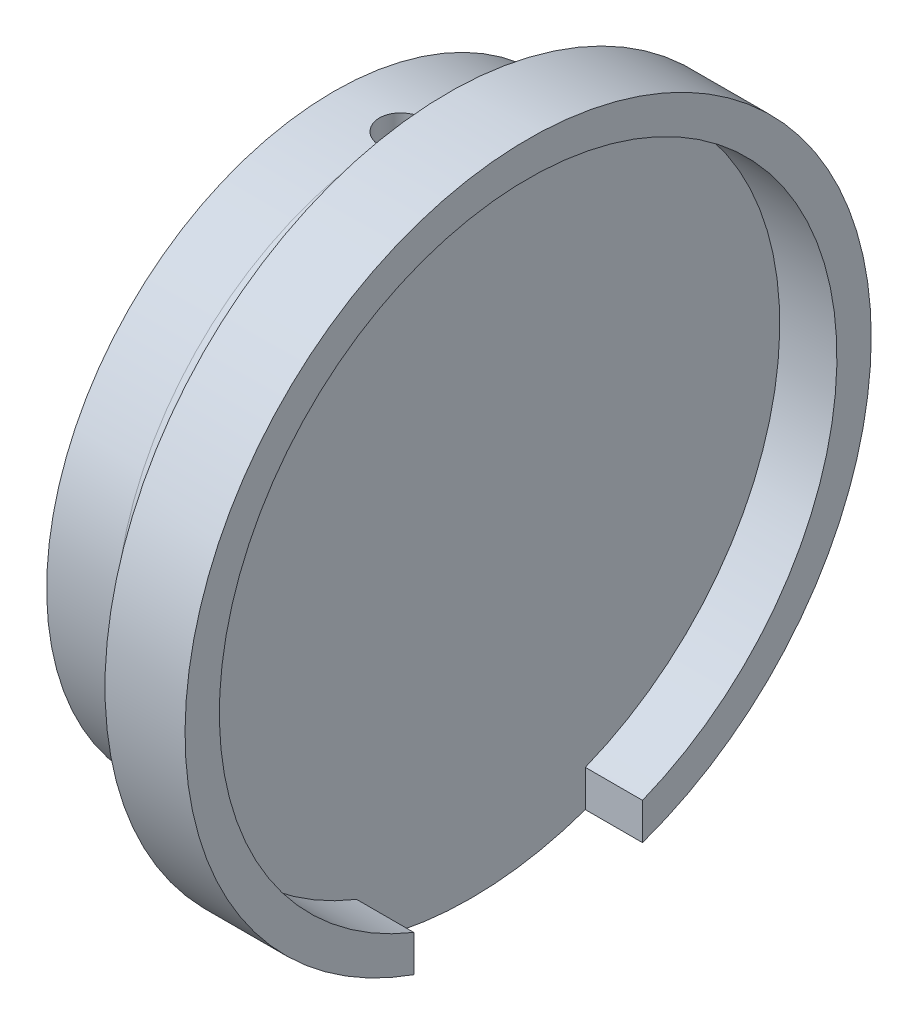
ISO-10303-21;
HEADER;
FILE_DESCRIPTION(('STEP AP214'),'2;1');
FILE_NAME('part.step','',(''),(''),'','','');
FILE_SCHEMA(('AUTOMOTIVE_DESIGN { 1 0 10303 214 1 1 1 1 }'));
ENDSEC;
DATA;
#1=APPLICATION_CONTEXT('core data for automotive mechanical design processes');
#2=APPLICATION_PROTOCOL_DEFINITION('international standard','automotive_design',2000,#1);
#3=PRODUCT_CONTEXT('',#1,'mechanical');
#4=PRODUCT('Part','Part','',(#3));
#5=PRODUCT_RELATED_PRODUCT_CATEGORY('part','',(#4));
#6=PRODUCT_DEFINITION_FORMATION('','',#4);
#7=PRODUCT_DEFINITION_CONTEXT('part definition',#1,'design');
#8=PRODUCT_DEFINITION('design','',#6,#7);
#9=PRODUCT_DEFINITION_SHAPE('','',#8);
#10=(LENGTH_UNIT() NAMED_UNIT(*) SI_UNIT(.MILLI.,.METRE.));
#11=(NAMED_UNIT(*) PLANE_ANGLE_UNIT() SI_UNIT($,.RADIAN.));
#12=(NAMED_UNIT(*) SI_UNIT($,.STERADIAN.) SOLID_ANGLE_UNIT());
#13=UNCERTAINTY_MEASURE_WITH_UNIT(LENGTH_MEASURE(1.E-05),#10,'distance_accuracy_value','');
#14=(GEOMETRIC_REPRESENTATION_CONTEXT(3) GLOBAL_UNCERTAINTY_ASSIGNED_CONTEXT((#13)) GLOBAL_UNIT_ASSIGNED_CONTEXT((#10,
#11,#12)) REPRESENTATION_CONTEXT('',''));
#15=CARTESIAN_POINT('',(0.,0.,0.));
#16=DIRECTION('',(0.,0.,1.));
#17=DIRECTION('',(1.,0.,0.));
#18=AXIS2_PLACEMENT_3D('',#15,#16,#17);
#19=CARTESIAN_POINT('',(6.,0.,0.));
#20=DIRECTION('',(-1.,0.,0.));
#21=DIRECTION('',(0.,0.,1.));
#22=AXIS2_PLACEMENT_3D('',#19,#20,#21);
#23=CYLINDRICAL_SURFACE('',#22,12.55);
#24=CARTESIAN_POINT('',(0.,0.,0.));
#25=DIRECTION('',(1.,0.,0.));
#26=DIRECTION('',(0.,0.,-1.));
#27=AXIS2_PLACEMENT_3D('',#24,#25,#26);
#28=CIRCLE('',#27,12.55);
#29=CARTESIAN_POINT('',(0.,0.,-12.55));
#30=VERTEX_POINT('',#29);
#31=EDGE_CURVE('E203',#30,#30,#28,.T.);
#32=ORIENTED_EDGE('',*,*,#31,.T.);
#33=EDGE_LOOP('',(#32));
#34=FACE_BOUND('',#33,.T.);
#35=CARTESIAN_POINT('',(3.,12.5100959228936,-1.));
#36=CARTESIAN_POINT('',(3.05607469499357,12.5100964526146,-0.999997546739263));
#37=CARTESIAN_POINT('',(3.11218777829105,12.5104770009579,-0.995267578739973));
#38=CARTESIAN_POINT('',(3.22286198828818,12.5119580995085,-0.976468119966159));
#39=CARTESIAN_POINT('',(3.27742127318235,12.5130594698738,-0.962387990224174));
#40=CARTESIAN_POINT('',(3.38336889513245,12.5158566801776,-0.92529745917909));
#41=CARTESIAN_POINT('',(3.43475898700157,12.5175521875971,-0.902292052289981));
#42=CARTESIAN_POINT('',(3.53293576691366,12.5213462134671,-0.848012739207154));
#43=CARTESIAN_POINT('',(3.57972344976571,12.5234446445349,-0.816740625271618));
#44=CARTESIAN_POINT('',(3.66749010381706,12.5278136397397,-0.746735746382406));
#45=CARTESIAN_POINT('',(3.70845673066781,12.5300845544623,-0.707987525551142));
#46=CARTESIAN_POINT('',(3.78331239267315,12.5345394227661,-0.624162947427995));
#47=CARTESIAN_POINT('',(3.81720112139419,12.5367233725788,-0.579086316292429));
#48=CARTESIAN_POINT('',(3.87697962329371,12.5407615169639,-0.483811425514186));
#49=CARTESIAN_POINT('',(3.90285878363937,12.5426152726547,-0.433606486854583));
#50=CARTESIAN_POINT('',(3.9458156437529,12.545780394251,-0.329546749074967));
#51=CARTESIAN_POINT('',(3.96289348582533,12.5470917689259,-0.275692008982885));
#52=CARTESIAN_POINT('',(3.98772758479719,12.5490219255725,-0.165983724330662));
#53=CARTESIAN_POINT('',(3.99550372447972,12.5496421846377,-0.110134706930861));
#54=CARTESIAN_POINT('',(4.00157513516299,12.5501252240788,0.002079034375169));
#55=CARTESIAN_POINT('',(3.99987056888868,12.5499880174557,0.0584437494134894));
#56=CARTESIAN_POINT('',(3.98704524038246,12.5489728062233,0.169954111105817));
#57=CARTESIAN_POINT('',(3.97594585996639,12.5480964837961,0.22510223442625));
#58=CARTESIAN_POINT('',(3.94467920796125,12.5457035602777,0.332750208832182));
#59=CARTESIAN_POINT('',(3.92451185639069,12.544186953539,0.385250036554592));
#60=CARTESIAN_POINT('',(3.87565783364616,12.540681212723,0.486179301478755));
#61=CARTESIAN_POINT('',(3.84696156418825,12.5386915467812,0.534604073484158));
#62=CARTESIAN_POINT('',(3.78187125821065,12.5344633477448,0.625957702846895));
#63=CARTESIAN_POINT('',(3.74547707914956,12.5322248100424,0.668886458411425));
#64=CARTESIAN_POINT('',(3.66590349251671,12.5277431693269,0.748154439305018));
#65=CARTESIAN_POINT('',(3.6227055096142,12.5255000709151,0.784475020541218));
#66=CARTESIAN_POINT('',(3.53081534861313,12.5212683907724,0.849351662321607));
#67=CARTESIAN_POINT('',(3.48212316652859,12.5192798092262,0.877907717232668));
#68=CARTESIAN_POINT('',(3.38061395081758,12.5157819109752,0.926443874440319));
#69=CARTESIAN_POINT('',(3.32779646973718,12.5142726463502,0.946423044907074));
#70=CARTESIAN_POINT('',(3.21954203575353,12.511905236907,0.977224677627526));
#71=CARTESIAN_POINT('',(3.16410513316293,12.5110470795881,0.988047315680286));
#72=CARTESIAN_POINT('',(3.05234854912301,12.5100810358463,1.00020513989674));
#73=CARTESIAN_POINT('',(2.99603171134505,12.5099710946849,1.00156630920588));
#74=CARTESIAN_POINT('',(2.88397063069316,12.510508505902,0.994830585723685));
#75=CARTESIAN_POINT('',(2.82822638294691,12.5111558518311,0.986733773480174));
#76=CARTESIAN_POINT('',(2.71896723047464,12.513133021653,0.961333571720078));
#77=CARTESIAN_POINT('',(2.66544949645185,12.5144619489041,0.944042276737334));
#78=CARTESIAN_POINT('',(2.56207496192578,12.5176517945726,0.900756231934743));
#79=CARTESIAN_POINT('',(2.51221821521745,12.5195127208053,0.874761354254707));
#80=CARTESIAN_POINT('',(2.41746191531079,12.5235618627505,0.814740167453415));
#81=CARTESIAN_POINT('',(2.37257337199629,12.525750781029,0.780696524978534));
#82=CARTESIAN_POINT('',(2.28913890307259,12.5302068745256,0.705569253844884));
#83=CARTESIAN_POINT('',(2.25059307735842,12.5324740509754,0.664485514328466));
#84=CARTESIAN_POINT('',(2.18084970885845,12.5368373019557,0.576332072132416));
#85=CARTESIAN_POINT('',(2.14966903471841,12.5389329766574,0.529249001172144));
#86=CARTESIAN_POINT('',(2.09565675364316,12.5427113392584,0.430500138453741));
#87=CARTESIAN_POINT('',(2.07282506944572,12.5443940309794,0.378834389109589));
#88=CARTESIAN_POINT('',(2.03618791938598,12.5471549822108,0.272447522197831));
#89=CARTESIAN_POINT('',(2.02237197449091,12.5482339432313,0.217730032301262));
#90=CARTESIAN_POINT('',(2.00412422917633,12.5496687028929,0.106743026463964));
#91=CARTESIAN_POINT('',(1.99969226786936,12.5500245139323,0.0504735371488685));
#92=CARTESIAN_POINT('',(2.00034010391879,12.549972906646,-0.0618537800813961));
#93=CARTESIAN_POINT('',(2.00539359141663,12.5495675994381,-0.117911762587571));
#94=CARTESIAN_POINT('',(2.02481407083017,12.5480434791887,-0.22838023288578));
#95=CARTESIAN_POINT('',(2.03918107625207,12.5469246651124,-0.282790718288537));
#96=CARTESIAN_POINT('',(2.07681420827452,12.5440991037119,-0.38842179058771));
#97=CARTESIAN_POINT('',(2.10007992555655,12.5423923834302,-0.439642524078746));
#98=CARTESIAN_POINT('',(2.15484695927505,12.5385820828605,-0.537455128520954));
#99=CARTESIAN_POINT('',(2.18634812927483,12.5364785096291,-0.584047081757316));
#100=CARTESIAN_POINT('',(2.25679050760773,12.5321037660722,-0.671414075973546));
#101=CARTESIAN_POINT('',(2.29575113519802,12.5298321680137,-0.712173437989586));
#102=CARTESIAN_POINT('',(2.37997247039661,12.5253810214819,-0.786590062760005));
#103=CARTESIAN_POINT('',(2.42523470445767,12.5232014954786,-0.820245599753484));
#104=CARTESIAN_POINT('',(2.52085507825021,12.5191771204791,-0.87954064210122));
#105=CARTESIAN_POINT('',(2.57122198330893,12.5173328628793,-0.905166039214482));
#106=CARTESIAN_POINT('',(2.67552341267481,12.5141951069137,-0.947563707300988));
#107=CARTESIAN_POINT('',(2.72945373886253,12.5129009733492,-0.96434619410386));
#108=CARTESIAN_POINT('',(2.8197538409993,12.5113440661914,-0.984290108521158));
#109=CARTESIAN_POINT('',(2.85554224133971,12.5108781522326,-0.99017352871574));
#110=CARTESIAN_POINT('',(2.92754841897797,12.5102539098106,-0.998029262339193));
#111=CARTESIAN_POINT('',(2.96376619523746,12.5100955806036,-1.00000158522433));
#112=CARTESIAN_POINT('',(3.,12.5100959228936,-1.));
#113=B_SPLINE_CURVE_WITH_KNOTS('',3,(#35,#36,#37,#38,#39,#40,#41,#42,#43,#44,#45,#46,#47,#48,
#49,#50,#51,#52,#53,#54,#55,#56,#57,#58,#59,#60,#61,#62,#63,#64,#65,#66,#67,#68,#69,#70,#71,#72,
#73,#74,#75,#76,#77,#78,#79,#80,#81,#82,#83,#84,#85,#86,#87,#88,#89,#90,#91,#92,#93,#94,#95,#96,
#97,#98,#99,#100,#101,#102,#103,#104,#105,#106,#107,#108,#109,#110,#111,#112),.UNSPECIFIED.,.T.,
.F.,(4,2,2,2,2,2,2,2,2,2,2,2,2,2,2,2,2,2,2,2,2,2,2,2,2,2,2,2,2,2,2,2,2,2,2,2,2,2,4),(0.,
0.168091792669204,0.336375174999905,0.504564524684607,0.6727174400475,0.841221788503965,
1.00973343074828,1.17846740760405,1.34719865619037,1.51556858636902,1.68393562668851,
1.85192050477809,2.01990686456004,2.18808299350947,2.35626223683171,2.52490885658597,
2.69355559869229,2.86222065867617,3.03088248033453,3.19908093818539,3.3672779636037,
3.53525428596162,3.70323307608798,3.87157696471728,4.03992350443549,4.20865195406766,
4.37737884223343,4.54590926744373,4.71443680319305,4.88249758351709,5.05055860755888,
5.21861190214321,5.38666220873245,5.55515610128105,5.72369087973961,5.89252011988367,
6.06115388893741,6.16977008246983,6.27838601338946),.UNSPECIFIED.);
#114=CARTESIAN_POINT('',(3.00000000000036,12.5100959228931,1.00000000000702));
#115=VERTEX_POINT('',#114);
#116=CARTESIAN_POINT('',(3.,12.5100959228936,-1.));
#117=VERTEX_POINT('',#116);
#118=EDGE_CURVE('E130',#115,#117,#113,.T.);
#119=ORIENTED_EDGE('',*,*,#118,.T.);
#120=CARTESIAN_POINT('',(3.,0.,0.));
#121=DIRECTION('',(1.,0.,0.));
#122=DIRECTION('',(0.,0.,-1.));
#123=AXIS2_PLACEMENT_3D('',#120,#121,#122);
#124=CIRCLE('',#123,12.55);
#125=CARTESIAN_POINT('',(2.99999999999964,-12.5100959228931,-1.00000000000702));
#126=VERTEX_POINT('',#125);
#127=EDGE_CURVE('E213',#117,#126,#124,.F.);
#128=ORIENTED_EDGE('',*,*,#127,.T.);
#129=CARTESIAN_POINT('',(3.,-12.5100959228936,1.));
#130=CARTESIAN_POINT('',(2.94392530500643,-12.5100964526146,0.999997546739263));
#131=CARTESIAN_POINT('',(2.88781222170895,-12.5104770009579,0.995267578739973));
#132=CARTESIAN_POINT('',(2.77713801171182,-12.5119580995085,0.976468119966159));
#133=CARTESIAN_POINT('',(2.72257872681765,-12.5130594698738,0.962387990224174));
#134=CARTESIAN_POINT('',(2.61663110486755,-12.5158566801776,0.92529745917909));
#135=CARTESIAN_POINT('',(2.56524101299843,-12.5175521875971,0.902292052289981));
#136=CARTESIAN_POINT('',(2.46706423308634,-12.5213462134671,0.848012739207154));
#137=CARTESIAN_POINT('',(2.42027655023429,-12.5234446445349,0.816740625271618));
#138=CARTESIAN_POINT('',(2.33250989618294,-12.5278136397397,0.746735746382406));
#139=CARTESIAN_POINT('',(2.29154326933219,-12.5300845544623,0.707987525551142));
#140=CARTESIAN_POINT('',(2.21668760732685,-12.5345394227661,0.624162947427995));
#141=CARTESIAN_POINT('',(2.18279887860581,-12.5367233725788,0.579086316292429));
#142=CARTESIAN_POINT('',(2.12302037670629,-12.5407615169639,0.483811425514187));
#143=CARTESIAN_POINT('',(2.09714121636063,-12.5426152726547,0.433606486854583));
#144=CARTESIAN_POINT('',(2.0541843562471,-12.545780394251,0.329546749074968));
#145=CARTESIAN_POINT('',(2.03710651417467,-12.5470917689259,0.275692008982886));
#146=CARTESIAN_POINT('',(2.01227241520281,-12.5490219255725,0.165983724330662));
#147=CARTESIAN_POINT('',(2.00449627552028,-12.5496421846377,0.110134706930862));
#148=CARTESIAN_POINT('',(1.99842486483701,-12.5501252240788,-0.00207903437516881));
#149=CARTESIAN_POINT('',(2.00012943111132,-12.5499880174557,-0.0584437494134892));
#150=CARTESIAN_POINT('',(2.01295475961754,-12.5489728062233,-0.169954111105816));
#151=CARTESIAN_POINT('',(2.02405414003361,-12.5480964837961,-0.22510223442625));
#152=CARTESIAN_POINT('',(2.05532079203876,-12.5457035602777,-0.332750208832182));
#153=CARTESIAN_POINT('',(2.07548814360931,-12.544186953539,-0.385250036554592));
#154=CARTESIAN_POINT('',(2.12434216635384,-12.540681212723,-0.486179301478755));
#155=CARTESIAN_POINT('',(2.15303843581175,-12.5386915467812,-0.534604073484158));
#156=CARTESIAN_POINT('',(2.21812874178935,-12.5344633477448,-0.625957702846895));
#157=CARTESIAN_POINT('',(2.25452292085044,-12.5322248100424,-0.668886458411425));
#158=CARTESIAN_POINT('',(2.33409650748329,-12.5277431693269,-0.748154439305018));
#159=CARTESIAN_POINT('',(2.3772944903858,-12.5255000709151,-0.784475020541218));
#160=CARTESIAN_POINT('',(2.46918465138687,-12.5212683907724,-0.849351662321607));
#161=CARTESIAN_POINT('',(2.51787683347141,-12.5192798092262,-0.877907717232668));
#162=CARTESIAN_POINT('',(2.61938604918242,-12.5157819109752,-0.926443874440319));
#163=CARTESIAN_POINT('',(2.67220353026282,-12.5142726463502,-0.946423044907074));
#164=CARTESIAN_POINT('',(2.78045796424647,-12.511905236907,-0.977224677627526));
#165=CARTESIAN_POINT('',(2.83589486683707,-12.5110470795881,-0.988047315680286));
#166=CARTESIAN_POINT('',(2.94765145087699,-12.5100810358463,-1.00020513989674));
#167=CARTESIAN_POINT('',(3.00396828865495,-12.5099710946849,-1.00156630920588));
#168=CARTESIAN_POINT('',(3.11602936930684,-12.510508505902,-0.994830585723685));
#169=CARTESIAN_POINT('',(3.17177361705309,-12.5111558518311,-0.986733773480174));
#170=CARTESIAN_POINT('',(3.28103276952536,-12.513133021653,-0.961333571720078));
#171=CARTESIAN_POINT('',(3.33455050354815,-12.5144619489041,-0.944042276737334));
#172=CARTESIAN_POINT('',(3.43792503807422,-12.5176517945726,-0.900756231934743));
#173=CARTESIAN_POINT('',(3.48778178478255,-12.5195127208053,-0.874761354254707));
#174=CARTESIAN_POINT('',(3.58253808468921,-12.5235618627505,-0.814740167453415));
#175=CARTESIAN_POINT('',(3.62742662800371,-12.525750781029,-0.780696524978534));
#176=CARTESIAN_POINT('',(3.71086109692741,-12.5302068745256,-0.705569253844884));
#177=CARTESIAN_POINT('',(3.74940692264158,-12.5324740509754,-0.664485514328466));
#178=CARTESIAN_POINT('',(3.81915029114155,-12.5368373019557,-0.576332072132416));
#179=CARTESIAN_POINT('',(3.85033096528159,-12.5389329766574,-0.529249001172143));
#180=CARTESIAN_POINT('',(3.90434324635684,-12.5427113392584,-0.43050013845374));
#181=CARTESIAN_POINT('',(3.92717493055428,-12.5443940309794,-0.378834389109589));
#182=CARTESIAN_POINT('',(3.96381208061402,-12.5471549822108,-0.272447522197831));
#183=CARTESIAN_POINT('',(3.97762802550909,-12.5482339432313,-0.217730032301262));
#184=CARTESIAN_POINT('',(3.99587577082367,-12.5496687028929,-0.106743026463964));
#185=CARTESIAN_POINT('',(4.00030773213065,-12.5500245139323,-0.0504735371488686));
#186=CARTESIAN_POINT('',(3.99965989608121,-12.549972906646,0.0618537800813963));
#187=CARTESIAN_POINT('',(3.99460640858337,-12.5495675994381,0.117911762587571));
#188=CARTESIAN_POINT('',(3.97518592916983,-12.5480434791887,0.22838023288578));
#189=CARTESIAN_POINT('',(3.96081892374793,-12.5469246651124,0.282790718288538));
#190=CARTESIAN_POINT('',(3.92318579172548,-12.5440991037119,0.38842179058771));
#191=CARTESIAN_POINT('',(3.89992007444345,-12.5423923834302,0.439642524078746));
#192=CARTESIAN_POINT('',(3.84515304072495,-12.5385820828605,0.537455128520954));
#193=CARTESIAN_POINT('',(3.81365187072517,-12.5364785096291,0.584047081757316));
#194=CARTESIAN_POINT('',(3.74320949239227,-12.5321037660722,0.671414075973546));
#195=CARTESIAN_POINT('',(3.70424886480198,-12.5298321680137,0.712173437989586));
#196=CARTESIAN_POINT('',(3.6200275296034,-12.5253810214819,0.786590062760005));
#197=CARTESIAN_POINT('',(3.57476529554233,-12.5232014954786,0.820245599753484));
#198=CARTESIAN_POINT('',(3.47914492174979,-12.5191771204791,0.87954064210122));
#199=CARTESIAN_POINT('',(3.42877801669107,-12.5173328628793,0.905166039214481));
#200=CARTESIAN_POINT('',(3.32447658732519,-12.5141951069137,0.947563707300988));
#201=CARTESIAN_POINT('',(3.27054626113747,-12.5129009733492,0.96434619410386));
#202=CARTESIAN_POINT('',(3.1802461590007,-12.5113440661914,0.984290108521158));
#203=CARTESIAN_POINT('',(3.14445775866029,-12.5108781522326,0.99017352871574));
#204=CARTESIAN_POINT('',(3.07245158102203,-12.5102539098106,0.998029262339193));
#205=CARTESIAN_POINT('',(3.03623380476254,-12.5100955806036,1.00000158522433));
#206=CARTESIAN_POINT('',(3.,-12.5100959228936,1.));
#207=B_SPLINE_CURVE_WITH_KNOTS('',3,(#129,#130,#131,#132,#133,#134,#135,#136,#137,#138,#139,
#140,#141,#142,#143,#144,#145,#146,#147,#148,#149,#150,#151,#152,#153,#154,#155,#156,#157,#158,
#159,#160,#161,#162,#163,#164,#165,#166,#167,#168,#169,#170,#171,#172,#173,#174,#175,#176,#177,
#178,#179,#180,#181,#182,#183,#184,#185,#186,#187,#188,#189,#190,#191,#192,#193,#194,#195,#196,
#197,#198,#199,#200,#201,#202,#203,#204,#205,#206),.UNSPECIFIED.,.T.,.F.,(4,2,2,2,2,2,2,2,2,2,2,
2,2,2,2,2,2,2,2,2,2,2,2,2,2,2,2,2,2,2,2,2,2,2,2,2,2,2,4),(0.,0.168091792669204,
0.336375174999905,0.504564524684607,0.6727174400475,0.841221788503965,1.00973343074828,
1.17846740760405,1.34719865619037,1.51556858636902,1.68393562668851,1.85192050477809,
2.01990686456004,2.18808299350947,2.35626223683171,2.52490885658597,2.69355559869229,
2.86222065867616,3.03088248033453,3.19908093818539,3.3672779636037,3.53525428596162,
3.70323307608798,3.87157696471728,4.03992350443549,4.20865195406766,4.37737884223343,
4.54590926744373,4.71443680319305,4.88249758351709,5.05055860755888,5.21861190214321,
5.38666220873245,5.55515610128105,5.7236908797396,5.89252011988367,6.06115388893741,
6.16977008246983,6.27838601338946),.UNSPECIFIED.);
#208=CARTESIAN_POINT('',(3.,-12.5100959228936,1.));
#209=VERTEX_POINT('',#208);
#210=EDGE_CURVE('E131',#209,#126,#207,.T.);
#211=ORIENTED_EDGE('',*,*,#210,.F.);
#212=CARTESIAN_POINT('',(3.,0.,0.));
#213=DIRECTION('',(1.,0.,0.));
#214=DIRECTION('',(0.,0.,-1.));
#215=AXIS2_PLACEMENT_3D('',#212,#213,#214);
#216=CIRCLE('',#215,12.55);
#217=EDGE_CURVE('E211',#209,#115,#216,.F.);
#218=ORIENTED_EDGE('',*,*,#217,.T.);
#219=EDGE_LOOP('',(#119,#128,#211,#218));
#220=FACE_BOUND('',#219,.T.);
#221=ADVANCED_FACE('F33',(#34,#220),#23,.T.);
#222=CARTESIAN_POINT('',(6.,0.,0.));
#223=DIRECTION('',(-1.,0.,0.));
#224=DIRECTION('',(0.,0.,1.));
#225=AXIS2_PLACEMENT_3D('',#222,#223,#224);
#226=CYLINDRICAL_SURFACE('',#225,3.2);
#227=CARTESIAN_POINT('',(3.,3.03973683071413,-1.));
#228=CARTESIAN_POINT('',(2.94532237112961,3.0397371679444,-0.99999963024345));
#229=CARTESIAN_POINT('',(2.89064098508778,3.0412282529855,-0.995500310344962));
#230=CARTESIAN_POINT('',(2.78288467134418,3.04700511293903,-0.977673403223082));
#231=CARTESIAN_POINT('',(2.72981018182351,3.05129164307935,-0.964343430262026));
#232=CARTESIAN_POINT('',(2.62684407843808,3.06212751043461,-0.929358305784155));
#233=CARTESIAN_POINT('',(2.57694701351108,3.06867284148665,-0.907717885892257));
#234=CARTESIAN_POINT('',(2.48147784331317,3.0832832498174,-0.856775313386413));
#235=CARTESIAN_POINT('',(2.43590650403309,3.09134859550518,-0.827471807245369));
#236=CARTESIAN_POINT('',(2.34881690600398,3.10840102132993,-0.760956856497509));
#237=CARTESIAN_POINT('',(2.30746911245088,3.11740898707314,-0.723527519776231));
#238=CARTESIAN_POINT('',(2.23152318943298,3.13515396688779,-0.642289637164482));
#239=CARTESIAN_POINT('',(2.19692600244421,3.1438909429824,-0.598480202014875));
#240=CARTESIAN_POINT('',(2.13471114959091,3.16034842711921,-0.504500729994665));
#241=CARTESIAN_POINT('',(2.10726903693481,3.16804147650186,-0.454209245216069));
#242=CARTESIAN_POINT('',(2.06129916011558,3.18130041466453,-0.349443386282729));
#243=CARTESIAN_POINT('',(2.04276930068034,3.18686680335945,-0.294969998789643));
#244=CARTESIAN_POINT('',(2.01571909752234,3.1950974065668,-0.185171485572876));
#245=CARTESIAN_POINT('',(2.00690740016972,3.19784591187312,-0.129924572374572));
#246=CARTESIAN_POINT('',(1.99862052284998,3.20042876700814,-0.0186726511876166));
#247=CARTESIAN_POINT('',(1.99914322051294,3.20026377928052,0.0373321815784667));
#248=CARTESIAN_POINT('',(2.00931863326876,3.1970969290603,0.146459584283788));
#249=CARTESIAN_POINT('',(2.01865550681042,3.19419320777728,0.199614907451235));
#250=CARTESIAN_POINT('',(2.0456759920344,3.18599586048681,0.303562450678216));
#251=CARTESIAN_POINT('',(2.06336014806924,3.18070207861698,0.354354516384956));
#252=CARTESIAN_POINT('',(2.10677615125991,3.16818767783636,0.452862482523825));
#253=CARTESIAN_POINT('',(2.13260384685043,3.16094426893602,0.500533124498265));
#254=CARTESIAN_POINT('',(2.19149687976364,3.14529378362813,0.590962008921623));
#255=CARTESIAN_POINT('',(2.22456404731025,3.13688641315531,0.633719004967068));
#256=CARTESIAN_POINT('',(2.29861890784105,3.11938936587859,0.714990158763107));
#257=CARTESIAN_POINT('',(2.33987925507302,3.11028585591808,0.75325323927535));
#258=CARTESIAN_POINT('',(2.42831608145951,3.09272492351789,0.822391794076293));
#259=CARTESIAN_POINT('',(2.47549325645977,3.08426757725855,0.853266398202702));
#260=CARTESIAN_POINT('',(2.57513397508811,3.06888677321224,0.907043720158153));
#261=CARTESIAN_POINT('',(2.62765072723478,3.06198152291129,0.929853445621562));
#262=CARTESIAN_POINT('',(2.73604759351541,3.05070036263463,0.966226767588001));
#263=CARTESIAN_POINT('',(2.79192649136515,3.04632354398012,0.979793686125952));
#264=CARTESIAN_POINT('',(2.90305596204684,3.04079650741015,0.996811881484679));
#265=CARTESIAN_POINT('',(2.95824159697895,3.03952373212419,1.00064763482981));
#266=CARTESIAN_POINT('',(3.06847179319649,3.04000862071333,0.999173955986524));
#267=CARTESIAN_POINT('',(3.12351637496392,3.04176581633218,0.993865936890527));
#268=CARTESIAN_POINT('',(3.23024663732646,3.0479916596061,0.974598988104683));
#269=CARTESIAN_POINT('',(3.28198341926057,3.05238043274495,0.960894649284177));
#270=CARTESIAN_POINT('',(3.38241743359546,3.0632902987222,0.925522989288344));
#271=CARTESIAN_POINT('',(3.43111416873658,3.06981173931781,0.90385436936927));
#272=CARTESIAN_POINT('',(3.52563128781778,3.084484317206,0.852460085246963));
#273=CARTESIAN_POINT('',(3.57132913247432,3.0926768279127,0.822521179908449));
#274=CARTESIAN_POINT('',(3.65719227708943,3.10968279178779,0.755685126943858));
#275=CARTESIAN_POINT('',(3.69735613514024,3.11849640588703,0.718786171752629));
#276=CARTESIAN_POINT('',(3.77272829273028,3.13619350049997,0.637258358202881));
#277=CARTESIAN_POINT('',(3.8076622289119,3.14506473828504,0.592372519830816));
#278=CARTESIAN_POINT('',(3.869512834657,3.16151247874982,0.497161236521119));
#279=CARTESIAN_POINT('',(3.89642987144883,3.16908904072767,0.446836040886898));
#280=CARTESIAN_POINT('',(3.94122444997735,3.18205049542799,0.342484418665465));
#281=CARTESIAN_POINT('',(3.95916743027495,3.18745119648957,0.288488147427004));
#282=CARTESIAN_POINT('',(3.98565803087177,3.19552194118864,0.178045803245112));
#283=CARTESIAN_POINT('',(3.9942085912668,3.19819283931423,0.121600502672285));
#284=CARTESIAN_POINT('',(4.0014328013997,3.20044642723569,0.0103879493191189));
#285=CARTESIAN_POINT('',(4.00050276013661,3.20015303525912,-0.0443513535572179));
#286=CARTESIAN_POINT('',(3.98975055116104,3.19680782464839,-0.152858577538598));
#287=CARTESIAN_POINT('',(3.97992896320644,3.19375618586094,-0.206626561743655));
#288=CARTESIAN_POINT('',(3.95192479262218,3.18527656675837,-0.311004094784633));
#289=CARTESIAN_POINT('',(3.9338483137237,3.17987878368167,-0.361644734759584));
#290=CARTESIAN_POINT('',(3.88994333823322,3.16726356470358,-0.459198740400072));
#291=CARTESIAN_POINT('',(3.86411351202125,3.16004581673077,-0.506111465019584));
#292=CARTESIAN_POINT('',(3.80442179332445,3.1442391750671,-0.596609355975752));
#293=CARTESIAN_POINT('',(3.77031718202884,3.13561207800806,-0.640027685642493));
#294=CARTESIAN_POINT('',(3.69547208844522,3.11806989237613,-0.72065663311945));
#295=CARTESIAN_POINT('',(3.65472962068844,3.10915471827727,-0.757865386803311));
#296=CARTESIAN_POINT('',(3.56614742412717,3.09169514062089,-0.826262927290038));
#297=CARTESIAN_POINT('',(3.51811727750693,3.08317280691291,-0.857211423957753));
#298=CARTESIAN_POINT('',(3.4172815037845,3.06784100223099,-0.910563765988108));
#299=CARTESIAN_POINT('',(3.36447781883909,3.06103083887145,-0.932971067228124));
#300=CARTESIAN_POINT('',(3.26022190614891,3.05045248354059,-0.96696944348656));
#301=CARTESIAN_POINT('',(3.20903796204108,3.04647452041439,-0.979319518703781));
#302=CARTESIAN_POINT('',(3.10523693432048,3.0411168517948,-0.995833966528002));
#303=CARTESIAN_POINT('',(3.05262020703014,3.03973650617324,-1.00000035584327));
#304=CARTESIAN_POINT('',(3.,3.03973683071413,-1.));
#305=B_SPLINE_CURVE_WITH_KNOTS('',3,(#227,#228,#229,#230,#231,#232,#233,#234,#235,#236,#237,
#238,#239,#240,#241,#242,#243,#244,#245,#246,#247,#248,#249,#250,#251,#252,#253,#254,#255,#256,
#257,#258,#259,#260,#261,#262,#263,#264,#265,#266,#267,#268,#269,#270,#271,#272,#273,#274,#275,
#276,#277,#278,#279,#280,#281,#282,#283,#284,#285,#286,#287,#288,#289,#290,#291,#292,#293,#294,
#295,#296,#297,#298,#299,#300,#301,#302,#303,#304),.UNSPECIFIED.,.T.,.F.,(4,2,2,2,2,2,2,2,2,2,2,
2,2,2,2,2,2,2,2,2,2,2,2,2,2,2,2,2,2,2,2,2,2,2,2,2,2,2,4),(0.,0.163838510014587,
0.327721301600959,0.491314915248036,0.654937443893129,0.823656644359877,0.992399383482153,
1.16495857566304,1.33747717929655,1.50466978263744,1.67182437172737,1.83320786371117,
1.99460188147392,2.15797123682044,2.32138194165867,2.49160271145184,2.66184351878338,
2.8339877674288,3.00607011157519,3.17123946622954,3.33638329765181,3.496751776254,
3.65714641792478,3.82214090637598,3.98717830399414,4.15905550239119,4.33092482643579,
4.50152191422708,4.67206558502378,4.8355104194153,4.99894459743755,5.16033477201717,
5.32175263919231,5.48864554474082,5.65558846207662,5.82806236391273,6.00046640632967,
6.15817883487019,6.31585239340933),.UNSPECIFIED.);
#306=CARTESIAN_POINT('',(3.,3.03973683071413,-1.));
#307=VERTEX_POINT('',#306);
#308=EDGE_CURVE('E123',#307,#307,#305,.T.);
#309=ORIENTED_EDGE('',*,*,#308,.T.);
#310=EDGE_LOOP('',(#309));
#311=FACE_BOUND('',#310,.T.);
#312=CARTESIAN_POINT('',(0.,0.,0.));
#313=DIRECTION('',(-1.,0.,0.));
#314=DIRECTION('',(0.,0.,1.));
#315=AXIS2_PLACEMENT_3D('',#312,#313,#314);
#316=CIRCLE('',#315,3.2);
#317=CARTESIAN_POINT('',(0.,0.,3.2));
#318=VERTEX_POINT('',#317);
#319=EDGE_CURVE('E200',#318,#318,#316,.T.);
#320=ORIENTED_EDGE('',*,*,#319,.T.);
#321=EDGE_LOOP('',(#320));
#322=FACE_BOUND('',#321,.T.);
#323=CARTESIAN_POINT('',(3.,-3.03973683071413,1.));
#324=CARTESIAN_POINT('',(3.05467762887039,-3.0397371679444,0.99999963024345));
#325=CARTESIAN_POINT('',(3.10935901491222,-3.0412282529855,0.995500310344962));
#326=CARTESIAN_POINT('',(3.21711532865582,-3.04700511293903,0.977673403223082));
#327=CARTESIAN_POINT('',(3.27018981817649,-3.05129164307935,0.964343430262027));
#328=CARTESIAN_POINT('',(3.37315592156192,-3.06212751043461,0.929358305784155));
#329=CARTESIAN_POINT('',(3.42305298648892,-3.06867284148665,0.907717885892257));
#330=CARTESIAN_POINT('',(3.51852215668683,-3.0832832498174,0.856775313386413));
#331=CARTESIAN_POINT('',(3.56409349596691,-3.09134859550518,0.82747180724537));
#332=CARTESIAN_POINT('',(3.65118309399602,-3.10840102132993,0.760956856497509));
#333=CARTESIAN_POINT('',(3.69253088754912,-3.11740898707314,0.723527519776231));
#334=CARTESIAN_POINT('',(3.76847681056702,-3.13515396688779,0.642289637164482));
#335=CARTESIAN_POINT('',(3.80307399755579,-3.1438909429824,0.598480202014875));
#336=CARTESIAN_POINT('',(3.86528885040909,-3.16034842711921,0.504500729994665));
#337=CARTESIAN_POINT('',(3.89273096306519,-3.16804147650186,0.454209245216069));
#338=CARTESIAN_POINT('',(3.93870083988441,-3.18130041466453,0.349443386282729));
#339=CARTESIAN_POINT('',(3.95723069931966,-3.18686680335945,0.294969998789643));
#340=CARTESIAN_POINT('',(3.98428090247766,-3.1950974065668,0.185171485572876));
#341=CARTESIAN_POINT('',(3.99309259983028,-3.19784591187312,0.129924572374571));
#342=CARTESIAN_POINT('',(4.00137947715002,-3.20042876700814,0.0186726511876164));
#343=CARTESIAN_POINT('',(4.00085677948706,-3.20026377928052,-0.0373321815784669));
#344=CARTESIAN_POINT('',(3.99068136673124,-3.1970969290603,-0.146459584283788));
#345=CARTESIAN_POINT('',(3.98134449318958,-3.19419320777728,-0.199614907451236));
#346=CARTESIAN_POINT('',(3.9543240079656,-3.18599586048681,-0.303562450678217));
#347=CARTESIAN_POINT('',(3.93663985193076,-3.18070207861698,-0.354354516384957));
#348=CARTESIAN_POINT('',(3.89322384874009,-3.16818767783636,-0.452862482523825));
#349=CARTESIAN_POINT('',(3.86739615314957,-3.16094426893602,-0.500533124498266));
#350=CARTESIAN_POINT('',(3.80850312023636,-3.14529378362813,-0.590962008921623));
#351=CARTESIAN_POINT('',(3.77543595268975,-3.13688641315531,-0.633719004967068));
#352=CARTESIAN_POINT('',(3.70138109215895,-3.11938936587859,-0.714990158763107));
#353=CARTESIAN_POINT('',(3.66012074492698,-3.11028585591808,-0.75325323927535));
#354=CARTESIAN_POINT('',(3.57168391854049,-3.09272492351789,-0.822391794076293));
#355=CARTESIAN_POINT('',(3.52450674354023,-3.08426757725855,-0.853266398202702));
#356=CARTESIAN_POINT('',(3.42486602491189,-3.06888677321224,-0.907043720158153));
#357=CARTESIAN_POINT('',(3.37234927276522,-3.06198152291129,-0.929853445621562));
#358=CARTESIAN_POINT('',(3.26395240648459,-3.05070036263463,-0.966226767588001));
#359=CARTESIAN_POINT('',(3.20807350863485,-3.04632354398012,-0.979793686125952));
#360=CARTESIAN_POINT('',(3.09694403795316,-3.04079650741015,-0.996811881484679));
#361=CARTESIAN_POINT('',(3.04175840302105,-3.03952373212419,-1.00064763482981));
#362=CARTESIAN_POINT('',(2.93152820680351,-3.04000862071333,-0.999173955986524));
#363=CARTESIAN_POINT('',(2.87648362503608,-3.04176581633218,-0.993865936890527));
#364=CARTESIAN_POINT('',(2.76975336267354,-3.0479916596061,-0.974598988104683));
#365=CARTESIAN_POINT('',(2.71801658073943,-3.05238043274495,-0.960894649284177));
#366=CARTESIAN_POINT('',(2.61758256640454,-3.0632902987222,-0.925522989288344));
#367=CARTESIAN_POINT('',(2.56888583126342,-3.06981173931781,-0.90385436936927));
#368=CARTESIAN_POINT('',(2.47436871218222,-3.084484317206,-0.852460085246963));
#369=CARTESIAN_POINT('',(2.42867086752568,-3.0926768279127,-0.822521179908449));
#370=CARTESIAN_POINT('',(2.34280772291057,-3.10968279178779,-0.755685126943858));
#371=CARTESIAN_POINT('',(2.30264386485976,-3.11849640588703,-0.718786171752629));
#372=CARTESIAN_POINT('',(2.22727170726972,-3.13619350049997,-0.637258358202881));
#373=CARTESIAN_POINT('',(2.1923377710881,-3.14506473828504,-0.592372519830816));
#374=CARTESIAN_POINT('',(2.130487165343,-3.16151247874982,-0.497161236521119));
#375=CARTESIAN_POINT('',(2.10357012855117,-3.16908904072767,-0.446836040886898));
#376=CARTESIAN_POINT('',(2.05877555002265,-3.18205049542799,-0.342484418665465));
#377=CARTESIAN_POINT('',(2.04083256972505,-3.18745119648957,-0.288488147427004));
#378=CARTESIAN_POINT('',(2.01434196912824,-3.19552194118864,-0.178045803245111));
#379=CARTESIAN_POINT('',(2.0057914087332,-3.19819283931423,-0.121600502672285));
#380=CARTESIAN_POINT('',(1.9985671986003,-3.20044642723569,-0.0103879493191192));
#381=CARTESIAN_POINT('',(1.99949723986339,-3.20015303525912,0.0443513535572176));
#382=CARTESIAN_POINT('',(2.01024944883896,-3.19680782464839,0.152858577538598));
#383=CARTESIAN_POINT('',(2.02007103679356,-3.19375618586094,0.206626561743654));
#384=CARTESIAN_POINT('',(2.04807520737782,-3.18527656675837,0.311004094784633));
#385=CARTESIAN_POINT('',(2.0661516862763,-3.17987878368167,0.361644734759585));
#386=CARTESIAN_POINT('',(2.11005666176678,-3.16726356470358,0.459198740400073));
#387=CARTESIAN_POINT('',(2.13588648797875,-3.16004581673077,0.506111465019584));
#388=CARTESIAN_POINT('',(2.19557820667555,-3.1442391750671,0.596609355975752));
#389=CARTESIAN_POINT('',(2.22968281797116,-3.13561207800806,0.640027685642493));
#390=CARTESIAN_POINT('',(2.30452791155478,-3.11806989237613,0.720656633119451));
#391=CARTESIAN_POINT('',(2.34527037931156,-3.10915471827727,0.757865386803311));
#392=CARTESIAN_POINT('',(2.43385257587283,-3.09169514062089,0.826262927290038));
#393=CARTESIAN_POINT('',(2.48188272249307,-3.08317280691291,0.857211423957753));
#394=CARTESIAN_POINT('',(2.5827184962155,-3.06784100223099,0.910563765988107));
#395=CARTESIAN_POINT('',(2.63552218116091,-3.06103083887145,0.932971067228124));
#396=CARTESIAN_POINT('',(2.73977809385109,-3.05045248354059,0.96696944348656));
#397=CARTESIAN_POINT('',(2.79096203795892,-3.04647452041439,0.979319518703782));
#398=CARTESIAN_POINT('',(2.89476306567952,-3.04111685179481,0.995833966528002));
#399=CARTESIAN_POINT('',(2.94737979296986,-3.03973650617324,1.00000035584327));
#400=CARTESIAN_POINT('',(3.,-3.03973683071413,1.));
#401=B_SPLINE_CURVE_WITH_KNOTS('',3,(#323,#324,#325,#326,#327,#328,#329,#330,#331,#332,#333,
#334,#335,#336,#337,#338,#339,#340,#341,#342,#343,#344,#345,#346,#347,#348,#349,#350,#351,#352,
#353,#354,#355,#356,#357,#358,#359,#360,#361,#362,#363,#364,#365,#366,#367,#368,#369,#370,#371,
#372,#373,#374,#375,#376,#377,#378,#379,#380,#381,#382,#383,#384,#385,#386,#387,#388,#389,#390,
#391,#392,#393,#394,#395,#396,#397,#398,#399,#400),.UNSPECIFIED.,.T.,.F.,(4,2,2,2,2,2,2,2,2,2,2,
2,2,2,2,2,2,2,2,2,2,2,2,2,2,2,2,2,2,2,2,2,2,2,2,2,2,2,4),(0.,0.163838510014586,
0.327721301600959,0.491314915248035,0.654937443893129,0.823656644359877,0.992399383482153,
1.16495857566304,1.33747717929655,1.50466978263744,1.67182437172737,1.83320786371118,
1.99460188147392,2.15797123682044,2.32138194165867,2.49160271145184,2.66184351878338,
2.8339877674288,3.00607011157519,3.17123946622954,3.33638329765181,3.496751776254,
3.65714641792478,3.82214090637598,3.98717830399414,4.15905550239119,4.33092482643579,
4.50152191422708,4.67206558502378,4.8355104194153,4.99894459743755,5.16033477201717,
5.32175263919231,5.48864554474082,5.65558846207662,5.82806236391274,6.00046640632968,
6.15817883487019,6.31585239340933),.UNSPECIFIED.);
#402=CARTESIAN_POINT('',(3.,-3.03973683071413,1.));
#403=VERTEX_POINT('',#402);
#404=EDGE_CURVE('E117',#403,#403,#401,.T.);
#405=ORIENTED_EDGE('',*,*,#404,.F.);
#406=EDGE_LOOP('',(#405));
#407=FACE_BOUND('',#406,.T.);
#408=CARTESIAN_POINT('',(5.,0.,0.));
#409=DIRECTION('',(1.,0.,0.));
#410=DIRECTION('',(0.,0.,-1.));
#411=AXIS2_PLACEMENT_3D('',#408,#409,#410);
#412=CIRCLE('',#411,3.2);
#413=CARTESIAN_POINT('',(5.,0.,-3.2));
#414=VERTEX_POINT('',#413);
#415=EDGE_CURVE('E205',#414,#414,#412,.F.);
#416=ORIENTED_EDGE('',*,*,#415,.F.);
#417=EDGE_LOOP('',(#416));
#418=FACE_BOUND('',#417,.T.);
#419=ADVANCED_FACE('F169',(#311,#322,#407,#418),#226,.F.);
#420=CARTESIAN_POINT('',(0.,0.,0.));
#421=DIRECTION('',(1.,0.,0.));
#422=DIRECTION('',(0.,0.,-1.));
#423=AXIS2_PLACEMENT_3D('',#420,#421,#422);
#424=PLANE('',#423);
#425=ORIENTED_EDGE('',*,*,#319,.F.);
#426=EDGE_LOOP('',(#425));
#427=FACE_BOUND('',#426,.T.);
#428=ORIENTED_EDGE('',*,*,#31,.F.);
#429=EDGE_LOOP('',(#428));
#430=FACE_BOUND('',#429,.T.);
#431=ADVANCED_FACE('F174',(#427,#430),#424,.F.);
#432=CARTESIAN_POINT('',(3.,-12.551,0.));
#433=DIRECTION('',(0.,1.,0.));
#434=DIRECTION('',(0.,0.,1.));
#435=AXIS2_PLACEMENT_3D('',#432,#433,#434);
#436=CYLINDRICAL_SURFACE('',#435,1.);
#437=ORIENTED_EDGE('',*,*,#404,.T.);
#438=EDGE_LOOP('',(#437));
#439=FACE_BOUND('',#438,.T.);
#440=ORIENTED_EDGE('',*,*,#210,.T.);
#441=CARTESIAN_POINT('',(3.,-12.5100959228936,-1.));
#442=CARTESIAN_POINT('',(3.02592482875469,-12.5100925563813,-1.00000181823637));
#443=CARTESIAN_POINT('',(3.05183536535292,-12.5106828371454,-0.998991151427434));
#444=CARTESIAN_POINT('',(3.10343579750416,-12.5130151321919,-0.994972455655272));
#445=CARTESIAN_POINT('',(3.12912579972388,-12.5147565537175,-0.991965454660965));
#446=CARTESIAN_POINT('',(3.20529335899246,-12.5216259619642,-0.980040461887902));
#447=CARTESIAN_POINT('',(3.25520220738145,-12.5284000345274,-0.968217656913627));
#448=CARTESIAN_POINT('',(3.35192718823811,-12.5456350363021,-0.937403995279254));
#449=CARTESIAN_POINT('',(3.39874823042373,-12.556089936428,-0.918424856891702));
#450=CARTESIAN_POINT('',(3.48851524433676,-12.5797287433775,-0.873993491447742));
#451=CARTESIAN_POINT('',(3.53145617050636,-12.5929161321228,-0.848532995852592));
#452=CARTESIAN_POINT('',(3.61581783392629,-12.6219807955216,-0.789690633928881));
#453=CARTESIAN_POINT('',(3.65687681030918,-12.6379861769669,-0.755854711961684));
#454=CARTESIAN_POINT('',(3.73307269311064,-12.6704513651733,-0.682213569553591));
#455=CARTESIAN_POINT('',(3.76820487869959,-12.6869115221433,-0.642403637914207));
#456=CARTESIAN_POINT('',(3.83522302172578,-12.7204172976336,-0.5530247576562));
#457=CARTESIAN_POINT('',(3.8663957342516,-12.7373469404445,-0.502872072901445));
#458=CARTESIAN_POINT('',(3.91972324594161,-12.7677079663922,-0.397005142139249));
#459=CARTESIAN_POINT('',(3.94188571005799,-12.7811423194282,-0.341295673708243));
#460=CARTESIAN_POINT('',(3.97485836948156,-12.8016315408712,-0.229764687972458));
#461=CARTESIAN_POINT('',(3.98634686965003,-12.8090629131159,-0.17421661832141));
#462=CARTESIAN_POINT('',(3.99971060029029,-12.8177387705494,-0.0615284843242559));
#463=CARTESIAN_POINT('',(4.00159881960462,-12.8189916150003,-0.00439067620100391));
#464=CARTESIAN_POINT('',(3.9961052160843,-12.8154027236134,0.10056170336207));
#465=CARTESIAN_POINT('',(3.99007457888569,-12.8114490649019,0.148486309515093));
#466=CARTESIAN_POINT('',(3.97133880074229,-12.7994719962882,0.242483707967146));
#467=CARTESIAN_POINT('',(3.9586312621,-12.7914471244356,0.288555828630132));
#468=CARTESIAN_POINT('',(3.92680535529989,-12.7720826267452,0.378624487941748));
#469=CARTESIAN_POINT('',(3.90757640069626,-12.760686286747,0.42256917159335));
#470=CARTESIAN_POINT('',(3.86337263023599,-12.7357753443765,0.506806711451563));
#471=CARTESIAN_POINT('',(3.83839525369358,-12.7222597988429,0.547097929005624));
#472=CARTESIAN_POINT('',(3.7789392917338,-12.6920720451512,0.62945723428549));
#473=CARTESIAN_POINT('',(3.74358884440205,-12.6752348330769,0.670837239695611));
#474=CARTESIAN_POINT('',(3.66655639933574,-12.6418778392416,0.747432972743099));
#475=CARTESIAN_POINT('',(3.62486879946228,-12.6253583530564,0.782643186311795));
#476=CARTESIAN_POINT('',(3.53228405997667,-12.5929674042811,0.848618824727327));
#477=CARTESIAN_POINT('',(3.48091864679092,-12.5772513499842,0.878809937120801));
#478=CARTESIAN_POINT('',(3.3727999402922,-12.549906778643,0.929826187451372));
#479=CARTESIAN_POINT('',(3.31605921993409,-12.5382690083052,0.950672558269085));
#480=CARTESIAN_POINT('',(3.21591695444269,-12.5231723456172,0.977359972636106));
#481=CARTESIAN_POINT('',(3.1734050322805,-12.5183213388642,0.98579729484732));
#482=CARTESIAN_POINT('',(3.08728278037271,-12.5117589620113,0.997140418573248));
#483=CARTESIAN_POINT('',(3.04366945364833,-12.5100573731303,1.00002898824873));
#484=CARTESIAN_POINT('',(3.,-12.5100959228936,1.));
#485=B_SPLINE_CURVE_WITH_KNOTS('',3,(#441,#442,#443,#444,#445,#446,#447,#448,#449,#450,#451,
#452,#453,#454,#455,#456,#457,#458,#459,#460,#461,#462,#463,#464,#465,#466,#467,#468,#469,#470,
#471,#472,#473,#474,#475,#476,#477,#478,#479,#480,#481,#482,#483,#484),.UNSPECIFIED.,.F.,.F.,(4,
2,2,2,2,2,2,2,2,2,2,2,2,2,2,2,2,2,2,2,2,4),(0.,0.0777206621947906,0.155401334831407,
0.309775661923968,0.463898295964427,0.618218544771262,0.784232567450445,0.950378206204335,
1.13373437575568,1.31693423752688,1.48748195769907,1.65779887128198,1.80250632299463,
1.94726577518541,2.09461409369444,2.24202817730684,2.41222943629753,2.58258204028512,
2.76645076645838,2.94989956651574,3.08027888097813,3.21106244235369),.UNSPECIFIED.);
#486=EDGE_CURVE('E47',#126,#209,#485,.T.);
#487=ORIENTED_EDGE('',*,*,#486,.T.);
#488=EDGE_LOOP('',(#440,#487));
#489=FACE_BOUND('',#488,.T.);
#490=ADVANCED_FACE('F181',(#439,#489),#436,.F.);
#491=CARTESIAN_POINT('',(3.,12.551,0.));
#492=DIRECTION('',(0.,-1.,0.));
#493=DIRECTION('',(0.,0.,-1.));
#494=AXIS2_PLACEMENT_3D('',#491,#492,#493);
#495=CYLINDRICAL_SURFACE('',#494,1.);
#496=ORIENTED_EDGE('',*,*,#308,.F.);
#497=EDGE_LOOP('',(#496));
#498=FACE_BOUND('',#497,.T.);
#499=ORIENTED_EDGE('',*,*,#118,.F.);
#500=CARTESIAN_POINT('',(3.,12.5100959228936,1.));
#501=CARTESIAN_POINT('',(3.02592482875469,12.5100925563813,1.00000181823637));
#502=CARTESIAN_POINT('',(3.05183536535292,12.5106828371454,0.998991151427434));
#503=CARTESIAN_POINT('',(3.10343579750416,12.5130151321919,0.994972455655272));
#504=CARTESIAN_POINT('',(3.12912579972388,12.5147565537175,0.991965454660965));
#505=CARTESIAN_POINT('',(3.20529335899246,12.5216259619642,0.980040461887902));
#506=CARTESIAN_POINT('',(3.25520220738145,12.5284000345274,0.968217656913627));
#507=CARTESIAN_POINT('',(3.35192718823811,12.5456350363021,0.937403995279254));
#508=CARTESIAN_POINT('',(3.39874823042373,12.556089936428,0.918424856891702));
#509=CARTESIAN_POINT('',(3.48851524433676,12.5797287433775,0.873993491447742));
#510=CARTESIAN_POINT('',(3.53145617050636,12.5929161321228,0.848532995852592));
#511=CARTESIAN_POINT('',(3.61581783392629,12.6219807955216,0.789690633928881));
#512=CARTESIAN_POINT('',(3.65687681030918,12.6379861769669,0.755854711961684));
#513=CARTESIAN_POINT('',(3.73307269311064,12.6704513651733,0.682213569553591));
#514=CARTESIAN_POINT('',(3.76820487869959,12.6869115221433,0.642403637914207));
#515=CARTESIAN_POINT('',(3.83522302172578,12.7204172976336,0.5530247576562));
#516=CARTESIAN_POINT('',(3.8663957342516,12.7373469404445,0.502872072901445));
#517=CARTESIAN_POINT('',(3.91972324594161,12.7677079663922,0.397005142139249));
#518=CARTESIAN_POINT('',(3.94188571005799,12.7811423194282,0.341295673708243));
#519=CARTESIAN_POINT('',(3.97485836948156,12.8016315408712,0.229764687972458));
#520=CARTESIAN_POINT('',(3.98634686965003,12.8090629131159,0.17421661832141));
#521=CARTESIAN_POINT('',(3.99971060029029,12.8177387705494,0.0615284843242559));
#522=CARTESIAN_POINT('',(4.00159881960462,12.8189916150003,0.00439067620100391));
#523=CARTESIAN_POINT('',(3.9961052160843,12.8154027236134,-0.10056170336207));
#524=CARTESIAN_POINT('',(3.99007457888569,12.8114490649019,-0.148486309515093));
#525=CARTESIAN_POINT('',(3.97133880074229,12.7994719962882,-0.242483707967146));
#526=CARTESIAN_POINT('',(3.9586312621,12.7914471244356,-0.288555828630132));
#527=CARTESIAN_POINT('',(3.92680535529989,12.7720826267452,-0.378624487941748));
#528=CARTESIAN_POINT('',(3.90757640069626,12.760686286747,-0.42256917159335));
#529=CARTESIAN_POINT('',(3.86337263023599,12.7357753443765,-0.506806711451563));
#530=CARTESIAN_POINT('',(3.83839525369358,12.7222597988429,-0.547097929005624));
#531=CARTESIAN_POINT('',(3.7789392917338,12.6920720451512,-0.62945723428549));
#532=CARTESIAN_POINT('',(3.74358884440205,12.6752348330769,-0.670837239695611));
#533=CARTESIAN_POINT('',(3.66655639933574,12.6418778392416,-0.747432972743099));
#534=CARTESIAN_POINT('',(3.62486879946228,12.6253583530564,-0.782643186311795));
#535=CARTESIAN_POINT('',(3.53228405997667,12.5929674042811,-0.848618824727327));
#536=CARTESIAN_POINT('',(3.48091864679092,12.5772513499842,-0.878809937120801));
#537=CARTESIAN_POINT('',(3.3727999402922,12.549906778643,-0.929826187451372));
#538=CARTESIAN_POINT('',(3.31605921993409,12.5382690083052,-0.950672558269085));
#539=CARTESIAN_POINT('',(3.21591695444269,12.5231723456172,-0.977359972636106));
#540=CARTESIAN_POINT('',(3.1734050322805,12.5183213388642,-0.98579729484732));
#541=CARTESIAN_POINT('',(3.08728278037271,12.5117589620113,-0.997140418573248));
#542=CARTESIAN_POINT('',(3.04366945364833,12.5100573731303,-1.00002898824873));
#543=CARTESIAN_POINT('',(3.,12.5100959228936,-1.));
#544=B_SPLINE_CURVE_WITH_KNOTS('',3,(#500,#501,#502,#503,#504,#505,#506,#507,#508,#509,#510,
#511,#512,#513,#514,#515,#516,#517,#518,#519,#520,#521,#522,#523,#524,#525,#526,#527,#528,#529,
#530,#531,#532,#533,#534,#535,#536,#537,#538,#539,#540,#541,#542,#543),.UNSPECIFIED.,.F.,.F.,(4,
2,2,2,2,2,2,2,2,2,2,2,2,2,2,2,2,2,2,2,2,4),(0.,0.0777206621947906,0.155401334831407,
0.309775661923968,0.463898295964427,0.618218544771262,0.784232567450445,0.950378206204335,
1.13373437575568,1.31693423752688,1.48748195769907,1.65779887128198,1.80250632299463,
1.94726577518541,2.09461409369444,2.24202817730684,2.41222943629753,2.58258204028512,
2.76645076645838,2.94989956651574,3.08027888097813,3.21106244235369),.UNSPECIFIED.);
#545=EDGE_CURVE('E11',#115,#117,#544,.T.);
#546=ORIENTED_EDGE('',*,*,#545,.T.);
#547=EDGE_LOOP('',(#499,#546));
#548=FACE_BOUND('',#547,.T.);
#549=ADVANCED_FACE('F137',(#498,#548),#495,.F.);
#550=CARTESIAN_POINT('',(5.,0.,0.));
#551=DIRECTION('',(1.,0.,0.));
#552=DIRECTION('',(0.,0.,-1.));
#553=AXIS2_PLACEMENT_3D('',#550,#551,#552);
#554=PLANE('',#553);
#555=ORIENTED_EDGE('',*,*,#415,.T.);
#556=EDGE_LOOP('',(#555));
#557=FACE_BOUND('',#556,.T.);
#558=ADVANCED_FACE('F148',(#557),#554,.F.);
#559=CARTESIAN_POINT('',(5.,0.,0.));
#560=DIRECTION('',(1.,0.,0.));
#561=DIRECTION('',(0.,0.,-1.));
#562=AXIS2_PLACEMENT_3D('',#559,#560,#561);
#563=CIRCLE('',#562,14.55);
#564=CARTESIAN_POINT('',(5.,0.,-14.55));
#565=VERTEX_POINT('',#564);
#566=EDGE_CURVE('E208',#565,#565,#563,.T.);
#567=ORIENTED_EDGE('',*,*,#566,.T.);
#568=EDGE_LOOP('',(#567));
#569=FACE_BOUND('',#568,.T.);
#570=CARTESIAN_POINT('',(5.,0.,0.));
#571=DIRECTION('',(1.,0.,0.));
#572=DIRECTION('',(0.,0.,-1.));
#573=AXIS2_PLACEMENT_3D('',#570,#571,#572);
#574=CIRCLE('',#573,15.);
#575=CARTESIAN_POINT('',(5.,0.,-15.));
#576=VERTEX_POINT('',#575);
#577=EDGE_CURVE('E113',#576,#576,#574,.T.);
#578=ORIENTED_EDGE('',*,*,#577,.F.);
#579=EDGE_LOOP('',(#578));
#580=FACE_BOUND('',#579,.T.);
#581=ADVANCED_FACE('F145',(#569,#580),#554,.F.);
#582=CARTESIAN_POINT('',(5.,0.,0.));
#583=DIRECTION('',(1.,0.,0.));
#584=DIRECTION('',(0.,0.,-1.));
#585=AXIS2_PLACEMENT_3D('',#582,#583,#584);
#586=CYLINDRICAL_SURFACE('',#585,15.);
#587=DIRECTION('',(1.,0.,0.));
#588=VECTOR('',#587,1.);
#589=CARTESIAN_POINT('',(5.,-14.142135623731,5.));
#590=LINE('',#589,#588);
#591=CARTESIAN_POINT('',(8.5,-14.142135623731,5.));
#592=VERTEX_POINT('',#591);
#593=CARTESIAN_POINT('',(6.,-14.142135623731,5.));
#594=VERTEX_POINT('',#593);
#595=EDGE_CURVE('E112',#592,#594,#590,.F.);
#596=ORIENTED_EDGE('',*,*,#595,.F.);
#597=CARTESIAN_POINT('',(8.5,0.,0.));
#598=DIRECTION('',(1.,0.,0.));
#599=DIRECTION('',(0.,0.,-1.));
#600=AXIS2_PLACEMENT_3D('',#597,#598,#599);
#601=CIRCLE('',#600,15.);
#602=CARTESIAN_POINT('',(8.5,-14.142135623731,-5.));
#603=VERTEX_POINT('',#602);
#604=EDGE_CURVE('E105',#603,#592,#601,.T.);
#605=ORIENTED_EDGE('',*,*,#604,.F.);
#606=DIRECTION('',(1.,0.,0.));
#607=VECTOR('',#606,1.);
#608=CARTESIAN_POINT('',(5.,-14.142135623731,-5.));
#609=LINE('',#608,#607);
#610=CARTESIAN_POINT('',(6.,-14.142135623731,-5.));
#611=VERTEX_POINT('',#610);
#612=EDGE_CURVE('E90',#611,#603,#609,.T.);
#613=ORIENTED_EDGE('',*,*,#612,.F.);
#614=CARTESIAN_POINT('',(6.,0.,0.));
#615=DIRECTION('',(-1.,0.,0.));
#616=DIRECTION('',(0.,0.,1.));
#617=AXIS2_PLACEMENT_3D('',#614,#615,#616);
#618=CIRCLE('',#617,15.);
#619=EDGE_CURVE('E330',#594,#611,#618,.F.);
#620=ORIENTED_EDGE('',*,*,#619,.F.);
#621=EDGE_LOOP('',(#596,#605,#613,#620));
#622=FACE_BOUND('',#621,.T.);
#623=ORIENTED_EDGE('',*,*,#577,.T.);
#624=EDGE_LOOP('',(#623));
#625=FACE_BOUND('',#624,.T.);
#626=ADVANCED_FACE('F110',(#622,#625),#586,.T.);
#627=CARTESIAN_POINT('',(8.5,0.,0.));
#628=DIRECTION('',(1.,0.,0.));
#629=DIRECTION('',(0.,0.,-1.));
#630=AXIS2_PLACEMENT_3D('',#627,#628,#629);
#631=PLANE('',#630);
#632=DIRECTION('',(0.,1.,0.));
#633=VECTOR('',#632,1.);
#634=CARTESIAN_POINT('',(8.5,-21.,5.));
#635=LINE('',#634,#633);
#636=CARTESIAN_POINT('',(8.5,-12.5399362039845,5.));
#637=VERTEX_POINT('',#636);
#638=EDGE_CURVE('E329',#592,#637,#635,.T.);
#639=ORIENTED_EDGE('',*,*,#638,.T.);
#640=CARTESIAN_POINT('',(8.5,0.,0.));
#641=DIRECTION('',(1.,0.,0.));
#642=DIRECTION('',(0.,0.,-1.));
#643=AXIS2_PLACEMENT_3D('',#640,#641,#642);
#644=CIRCLE('',#643,13.5);
#645=CARTESIAN_POINT('',(8.5,-12.5399362039845,-5.));
#646=VERTEX_POINT('',#645);
#647=EDGE_CURVE('E107',#646,#637,#644,.T.);
#648=ORIENTED_EDGE('',*,*,#647,.F.);
#649=DIRECTION('',(0.,1.,0.));
#650=VECTOR('',#649,1.);
#651=CARTESIAN_POINT('',(8.5,-21.,-5.));
#652=LINE('',#651,#650);
#653=EDGE_CURVE('E54',#603,#646,#652,.T.);
#654=ORIENTED_EDGE('',*,*,#653,.F.);
#655=ORIENTED_EDGE('',*,*,#604,.T.);
#656=EDGE_LOOP('',(#639,#648,#654,#655));
#657=FACE_BOUND('',#656,.T.);
#658=ADVANCED_FACE('F104',(#657),#631,.T.);
#659=CARTESIAN_POINT('',(6.,0.,0.));
#660=DIRECTION('',(1.,0.,0.));
#661=DIRECTION('',(0.,0.,-1.));
#662=AXIS2_PLACEMENT_3D('',#659,#660,#661);
#663=CYLINDRICAL_SURFACE('',#662,13.5);
#664=ORIENTED_EDGE('',*,*,#647,.T.);
#665=DIRECTION('',(1.,0.,0.));
#666=VECTOR('',#665,1.);
#667=CARTESIAN_POINT('',(6.,-12.5399362039845,5.));
#668=LINE('',#667,#666);
#669=CARTESIAN_POINT('',(6.,-12.5399362039845,5.));
#670=VERTEX_POINT('',#669);
#671=EDGE_CURVE('E97',#637,#670,#668,.F.);
#672=ORIENTED_EDGE('',*,*,#671,.T.);
#673=CARTESIAN_POINT('',(6.,0.,0.));
#674=DIRECTION('',(1.,0.,0.));
#675=DIRECTION('',(0.,0.,-1.));
#676=AXIS2_PLACEMENT_3D('',#673,#674,#675);
#677=CIRCLE('',#676,13.5);
#678=CARTESIAN_POINT('',(6.,-12.5399362039845,-5.));
#679=VERTEX_POINT('',#678);
#680=EDGE_CURVE('E114',#679,#670,#677,.T.);
#681=ORIENTED_EDGE('',*,*,#680,.F.);
#682=DIRECTION('',(1.,0.,0.));
#683=VECTOR('',#682,1.);
#684=CARTESIAN_POINT('',(6.,-12.5399362039845,-5.));
#685=LINE('',#684,#683);
#686=EDGE_CURVE('E98',#679,#646,#685,.T.);
#687=ORIENTED_EDGE('',*,*,#686,.T.);
#688=EDGE_LOOP('',(#664,#672,#681,#687));
#689=FACE_BOUND('',#688,.T.);
#690=ADVANCED_FACE('F152',(#689),#663,.F.);
#691=CARTESIAN_POINT('',(6.,0.,0.));
#692=DIRECTION('',(1.,0.,0.));
#693=DIRECTION('',(0.,0.,-1.));
#694=AXIS2_PLACEMENT_3D('',#691,#692,#693);
#695=PLANE('',#694);
#696=ORIENTED_EDGE('',*,*,#680,.T.);
#697=DIRECTION('',(0.,1.,0.));
#698=VECTOR('',#697,1.);
#699=CARTESIAN_POINT('',(6.,-21.,5.));
#700=LINE('',#699,#698);
#701=EDGE_CURVE('E327',#594,#670,#700,.T.);
#702=ORIENTED_EDGE('',*,*,#701,.F.);
#703=ORIENTED_EDGE('',*,*,#619,.T.);
#704=DIRECTION('',(0.,1.,0.));
#705=VECTOR('',#704,1.);
#706=CARTESIAN_POINT('',(6.,-21.,-5.));
#707=LINE('',#706,#705);
#708=EDGE_CURVE('E93',#611,#679,#707,.T.);
#709=ORIENTED_EDGE('',*,*,#708,.T.);
#710=EDGE_LOOP('',(#696,#702,#703,#709));
#711=FACE_BOUND('',#710,.T.);
#712=ADVANCED_FACE('F155',(#711),#695,.T.);
#713=CARTESIAN_POINT('',(3.,0.,0.));
#714=DIRECTION('',(1.,0.,0.));
#715=DIRECTION('',(0.,0.,-1.));
#716=AXIS2_PLACEMENT_3D('',#713,#714,#715);
#717=TOROIDAL_SURFACE('',#716,14.55,2.);
#718=ORIENTED_EDGE('',*,*,#486,.F.);
#719=ORIENTED_EDGE('',*,*,#127,.F.);
#720=ORIENTED_EDGE('',*,*,#545,.F.);
#721=ORIENTED_EDGE('',*,*,#217,.F.);
#722=EDGE_LOOP('',(#718,#719,#720,#721));
#723=FACE_BOUND('',#722,.T.);
#724=ORIENTED_EDGE('',*,*,#566,.F.);
#725=EDGE_LOOP('',(#724));
#726=FACE_BOUND('',#725,.T.);
#727=ADVANCED_FACE('F35',(#723,#726),#717,.F.);
#728=CARTESIAN_POINT('',(8.5,-21.,5.));
#729=DIRECTION('',(0.,0.,1.));
#730=DIRECTION('',(1.,0.,0.));
#731=AXIS2_PLACEMENT_3D('',#728,#729,#730);
#732=PLANE('',#731);
#733=ORIENTED_EDGE('',*,*,#595,.T.);
#734=ORIENTED_EDGE('',*,*,#701,.T.);
#735=ORIENTED_EDGE('',*,*,#671,.F.);
#736=ORIENTED_EDGE('',*,*,#638,.F.);
#737=EDGE_LOOP('',(#733,#734,#735,#736));
#738=FACE_BOUND('',#737,.T.);
#739=ADVANCED_FACE('F162',(#738),#732,.F.);
#740=CARTESIAN_POINT('',(8.5,-21.,-5.));
#741=DIRECTION('',(0.,0.,-1.));
#742=DIRECTION('',(-1.,0.,0.));
#743=AXIS2_PLACEMENT_3D('',#740,#741,#742);
#744=PLANE('',#743);
#745=ORIENTED_EDGE('',*,*,#612,.T.);
#746=ORIENTED_EDGE('',*,*,#653,.T.);
#747=ORIENTED_EDGE('',*,*,#686,.F.);
#748=ORIENTED_EDGE('',*,*,#708,.F.);
#749=EDGE_LOOP('',(#745,#746,#747,#748));
#750=FACE_BOUND('',#749,.T.);
#751=ADVANCED_FACE('F91',(#750),#744,.F.);
#752=CLOSED_SHELL('',(#221,#419,#431,#490,#549,#558,#581,#626,#658,#690,#712,#727,#739,#751));
#753=MANIFOLD_SOLID_BREP('B2',#752);
#754=ADVANCED_BREP_SHAPE_REPRESENTATION('',(#18,#753),#14);
#755=SHAPE_DEFINITION_REPRESENTATION(#9,#754);
ENDSEC;
END-ISO-10303-21;
